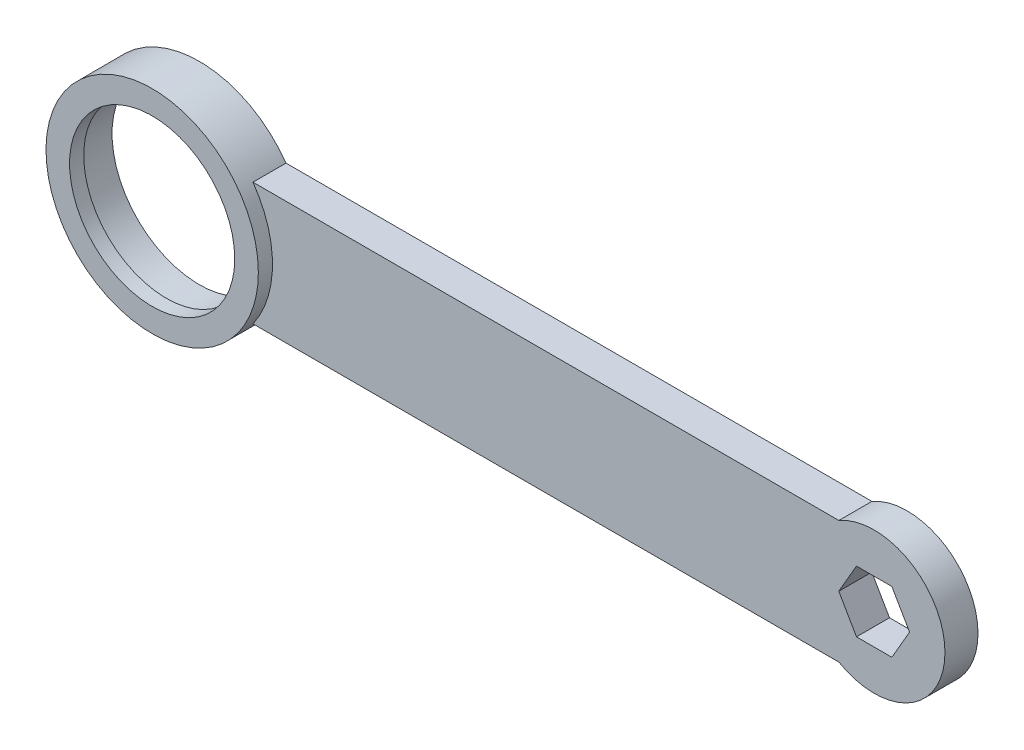
ISO-10303-21;
HEADER;
FILE_DESCRIPTION(('STEP AP214'),'2;1');
FILE_NAME('part.step','',(''),(''),'','','');
FILE_SCHEMA(('AUTOMOTIVE_DESIGN { 1 0 10303 214 1 1 1 1 }'));
ENDSEC;
DATA;
#1=APPLICATION_CONTEXT('core data for automotive mechanical design processes');
#2=APPLICATION_PROTOCOL_DEFINITION('international standard','automotive_design',2000,#1);
#3=PRODUCT_CONTEXT('',#1,'mechanical');
#4=PRODUCT('Part','Part','',(#3));
#5=PRODUCT_RELATED_PRODUCT_CATEGORY('part','',(#4));
#6=PRODUCT_DEFINITION_FORMATION('','',#4);
#7=PRODUCT_DEFINITION_CONTEXT('part definition',#1,'design');
#8=PRODUCT_DEFINITION('design','',#6,#7);
#9=PRODUCT_DEFINITION_SHAPE('','',#8);
#10=(LENGTH_UNIT() NAMED_UNIT(*) SI_UNIT(.MILLI.,.METRE.));
#11=(NAMED_UNIT(*) PLANE_ANGLE_UNIT() SI_UNIT($,.RADIAN.));
#12=(NAMED_UNIT(*) SI_UNIT($,.STERADIAN.) SOLID_ANGLE_UNIT());
#13=UNCERTAINTY_MEASURE_WITH_UNIT(LENGTH_MEASURE(1.E-05),#10,'distance_accuracy_value','');
#14=(GEOMETRIC_REPRESENTATION_CONTEXT(3) GLOBAL_UNCERTAINTY_ASSIGNED_CONTEXT((#13)) GLOBAL_UNIT_ASSIGNED_CONTEXT((#10,
#11,#12)) REPRESENTATION_CONTEXT('',''));
#15=CARTESIAN_POINT('',(0.,0.,0.));
#16=DIRECTION('',(0.,0.,1.));
#17=DIRECTION('',(1.,0.,0.));
#18=AXIS2_PLACEMENT_3D('',#15,#16,#17);
#19=CARTESIAN_POINT('',(-75.,0.,0.));
#20=DIRECTION('',(0.,0.,1.));
#21=DIRECTION('',(1.,0.,0.));
#22=AXIS2_PLACEMENT_3D('',#19,#20,#21);
#23=PLANE('',#22);
#24=CARTESIAN_POINT('',(-75.,0.,0.));
#25=DIRECTION('',(0.,0.,1.));
#26=DIRECTION('',(1.,0.,0.));
#27=AXIS2_PLACEMENT_3D('',#24,#25,#26);
#28=CIRCLE('',#27,22.5);
#29=CARTESIAN_POINT('',(-56.635632327793,13.,0.));
#30=VERTEX_POINT('',#29);
#31=CARTESIAN_POINT('',(-56.635632327793,-13.,0.));
#32=VERTEX_POINT('',#31);
#33=EDGE_CURVE('E152',#30,#32,#28,.T.);
#34=ORIENTED_EDGE('',*,*,#33,.F.);
#35=DIRECTION('',(-1.,0.,0.));
#36=VECTOR('',#35,1.);
#37=CARTESIAN_POINT('',(-56.635632327793,13.,0.));
#38=LINE('',#37,#36);
#39=CARTESIAN_POINT('',(67.5166852264522,13.,0.));
#40=VERTEX_POINT('',#39);
#41=EDGE_CURVE('E163',#40,#30,#38,.T.);
#42=ORIENTED_EDGE('',*,*,#41,.F.);
#43=CARTESIAN_POINT('',(75.,0.,0.));
#44=DIRECTION('',(0.,0.,1.));
#45=DIRECTION('',(1.,0.,0.));
#46=AXIS2_PLACEMENT_3D('',#43,#44,#45);
#47=CIRCLE('',#46,15.);
#48=CARTESIAN_POINT('',(67.5166852264522,-13.,0.));
#49=VERTEX_POINT('',#48);
#50=EDGE_CURVE('E161',#49,#40,#47,.T.);
#51=ORIENTED_EDGE('',*,*,#50,.F.);
#52=DIRECTION('',(1.,0.,0.));
#53=VECTOR('',#52,1.);
#54=CARTESIAN_POINT('',(-56.635632327793,-13.,0.));
#55=LINE('',#54,#53);
#56=EDGE_CURVE('E159',#32,#49,#55,.T.);
#57=ORIENTED_EDGE('',*,*,#56,.F.);
#58=EDGE_LOOP('',(#34,#42,#51,#57));
#59=FACE_BOUND('',#58,.T.);
#60=DIRECTION('',(1.,0.,0.));
#61=VECTOR('',#60,1.);
#62=CARTESIAN_POINT('',(-75.,-6.49519052838266,0.));
#63=LINE('',#62,#61);
#64=CARTESIAN_POINT('',(71.2499999999999,-6.49519052838325,0.));
#65=VERTEX_POINT('',#64);
#66=CARTESIAN_POINT('',(78.7499999999999,-6.49519052838328,0.));
#67=VERTEX_POINT('',#66);
#68=EDGE_CURVE('E41',#65,#67,#63,.T.);
#69=ORIENTED_EDGE('',*,*,#68,.T.);
#70=DIRECTION('',(0.500000000000002,0.866025403784438,0.));
#71=VECTOR('',#70,1.);
#72=CARTESIAN_POINT('',(43.1249999999997,-68.1995005480247,0.));
#73=LINE('',#72,#71);
#74=CARTESIAN_POINT('',(82.5,0.,0.));
#75=VERTEX_POINT('',#74);
#76=EDGE_CURVE('E11',#67,#75,#73,.T.);
#77=ORIENTED_EDGE('',*,*,#76,.T.);
#78=DIRECTION('',(-0.499999999999998,0.86602540378444,0.));
#79=VECTOR('',#78,1.);
#80=CARTESIAN_POINT('',(43.1250000000003,68.1995005480243,0.));
#81=LINE('',#80,#79);
#82=CARTESIAN_POINT('',(78.75,6.4951905283833,0.));
#83=VERTEX_POINT('',#82);
#84=EDGE_CURVE('E181',#75,#83,#81,.T.);
#85=ORIENTED_EDGE('',*,*,#84,.T.);
#86=DIRECTION('',(-1.,0.,0.));
#87=VECTOR('',#86,1.);
#88=CARTESIAN_POINT('',(-74.9999999999999,6.49519052838389,0.));
#89=LINE('',#88,#87);
#90=CARTESIAN_POINT('',(71.25,6.49519052838332,0.));
#91=VERTEX_POINT('',#90);
#92=EDGE_CURVE('E116',#83,#91,#89,.T.);
#93=ORIENTED_EDGE('',*,*,#92,.T.);
#94=DIRECTION('',(-0.500000000000003,-0.866025403784437,0.));
#95=VECTOR('',#94,1.);
#96=CARTESIAN_POINT('',(31.8749999999996,-61.7043100196414,0.));
#97=LINE('',#96,#95);
#98=CARTESIAN_POINT('',(67.5,0.,0.));
#99=VERTEX_POINT('',#98);
#100=EDGE_CURVE('E193',#91,#99,#97,.T.);
#101=ORIENTED_EDGE('',*,*,#100,.T.);
#102=DIRECTION('',(0.499999999999996,-0.866025403784441,0.));
#103=VECTOR('',#102,1.);
#104=CARTESIAN_POINT('',(31.8750000000006,61.7043100196409,0.));
#105=LINE('',#104,#103);
#106=EDGE_CURVE('E196',#99,#65,#105,.T.);
#107=ORIENTED_EDGE('',*,*,#106,.T.);
#108=EDGE_LOOP('',(#69,#77,#85,#93,#101,#107));
#109=FACE_BOUND('',#108,.T.);
#110=CARTESIAN_POINT('',(-75.,0.,0.));
#111=DIRECTION('',(0.,0.,1.));
#112=DIRECTION('',(1.,0.,0.));
#113=AXIS2_PLACEMENT_3D('',#110,#111,#112);
#114=CIRCLE('',#113,18.5);
#115=CARTESIAN_POINT('',(-56.5,0.,0.));
#116=VERTEX_POINT('',#115);
#117=EDGE_CURVE('E214',#116,#116,#114,.T.);
#118=ORIENTED_EDGE('',*,*,#117,.T.);
#119=EDGE_LOOP('',(#118));
#120=FACE_BOUND('',#119,.T.);
#121=ADVANCED_FACE('F32',(#59,#109,#120),#23,.F.);
#122=CARTESIAN_POINT('',(-75.,0.,7.));
#123=DIRECTION('',(0.,0.,-1.));
#124=DIRECTION('',(-1.,0.,0.));
#125=AXIS2_PLACEMENT_3D('',#122,#123,#124);
#126=CYLINDRICAL_SURFACE('',#125,22.5);
#127=ORIENTED_EDGE('',*,*,#33,.T.);
#128=DIRECTION('',(0.,0.,-1.));
#129=VECTOR('',#128,1.);
#130=CARTESIAN_POINT('',(-56.635632327793,-13.,7.));
#131=LINE('',#130,#129);
#132=CARTESIAN_POINT('',(-56.635632327793,-13.,7.));
#133=VERTEX_POINT('',#132);
#134=EDGE_CURVE('E172',#133,#32,#131,.T.);
#135=ORIENTED_EDGE('',*,*,#134,.F.);
#136=CARTESIAN_POINT('',(-75.,0.,7.));
#137=DIRECTION('',(0.,0.,1.));
#138=DIRECTION('',(1.,0.,0.));
#139=AXIS2_PLACEMENT_3D('',#136,#137,#138);
#140=CIRCLE('',#139,22.5);
#141=CARTESIAN_POINT('',(-56.635632327793,13.,7.));
#142=VERTEX_POINT('',#141);
#143=EDGE_CURVE('E177',#133,#142,#140,.T.);
#144=ORIENTED_EDGE('',*,*,#143,.T.);
#145=DIRECTION('',(0.,0.,-1.));
#146=VECTOR('',#145,1.);
#147=CARTESIAN_POINT('',(-56.635632327793,13.,7.));
#148=LINE('',#147,#146);
#149=EDGE_CURVE('E169',#142,#30,#148,.T.);
#150=ORIENTED_EDGE('',*,*,#149,.T.);
#151=EDGE_LOOP('',(#127,#135,#144,#150));
#152=FACE_BOUND('',#151,.T.);
#153=CARTESIAN_POINT('',(-75.,0.,10.));
#154=DIRECTION('',(0.,0.,1.));
#155=DIRECTION('',(1.,0.,0.));
#156=AXIS2_PLACEMENT_3D('',#153,#154,#155);
#157=CIRCLE('',#156,22.5);
#158=CARTESIAN_POINT('',(-52.5,0.,10.));
#159=VERTEX_POINT('',#158);
#160=EDGE_CURVE('E143',#159,#159,#157,.T.);
#161=ORIENTED_EDGE('',*,*,#160,.F.);
#162=EDGE_LOOP('',(#161));
#163=FACE_BOUND('',#162,.T.);
#164=ADVANCED_FACE('F34',(#152,#163),#126,.T.);
#165=CARTESIAN_POINT('',(-56.635632327793,-13.,7.));
#166=DIRECTION('',(0.,1.,0.));
#167=DIRECTION('',(-1.,0.,0.));
#168=AXIS2_PLACEMENT_3D('',#165,#166,#167);
#169=PLANE('',#168);
#170=ORIENTED_EDGE('',*,*,#56,.T.);
#171=DIRECTION('',(0.,0.,-1.));
#172=VECTOR('',#171,1.);
#173=CARTESIAN_POINT('',(67.5166852264522,-13.,7.));
#174=LINE('',#173,#172);
#175=CARTESIAN_POINT('',(67.5166852264522,-13.,7.));
#176=VERTEX_POINT('',#175);
#177=EDGE_CURVE('E168',#176,#49,#174,.T.);
#178=ORIENTED_EDGE('',*,*,#177,.F.);
#179=DIRECTION('',(1.,0.,0.));
#180=VECTOR('',#179,1.);
#181=CARTESIAN_POINT('',(-56.635632327793,-13.,7.));
#182=LINE('',#181,#180);
#183=EDGE_CURVE('E156',#133,#176,#182,.T.);
#184=ORIENTED_EDGE('',*,*,#183,.F.);
#185=ORIENTED_EDGE('',*,*,#134,.T.);
#186=EDGE_LOOP('',(#170,#178,#184,#185));
#187=FACE_BOUND('',#186,.T.);
#188=ADVANCED_FACE('F244',(#187),#169,.F.);
#189=CARTESIAN_POINT('',(75.,0.,7.));
#190=DIRECTION('',(0.,0.,-1.));
#191=DIRECTION('',(-1.,0.,0.));
#192=AXIS2_PLACEMENT_3D('',#189,#190,#191);
#193=CYLINDRICAL_SURFACE('',#192,15.);
#194=ORIENTED_EDGE('',*,*,#50,.T.);
#195=DIRECTION('',(0.,0.,-1.));
#196=VECTOR('',#195,1.);
#197=CARTESIAN_POINT('',(67.5166852264522,13.,7.));
#198=LINE('',#197,#196);
#199=CARTESIAN_POINT('',(67.5166852264522,13.,7.));
#200=VERTEX_POINT('',#199);
#201=EDGE_CURVE('E165',#200,#40,#198,.T.);
#202=ORIENTED_EDGE('',*,*,#201,.F.);
#203=CARTESIAN_POINT('',(75.,0.,7.));
#204=DIRECTION('',(0.,0.,1.));
#205=DIRECTION('',(1.,0.,0.));
#206=AXIS2_PLACEMENT_3D('',#203,#204,#205);
#207=CIRCLE('',#206,15.);
#208=EDGE_CURVE('E153',#176,#200,#207,.T.);
#209=ORIENTED_EDGE('',*,*,#208,.F.);
#210=ORIENTED_EDGE('',*,*,#177,.T.);
#211=EDGE_LOOP('',(#194,#202,#209,#210));
#212=FACE_BOUND('',#211,.T.);
#213=ADVANCED_FACE('F253',(#212),#193,.T.);
#214=CARTESIAN_POINT('',(-56.635632327793,13.,7.));
#215=DIRECTION('',(0.,-1.,0.));
#216=DIRECTION('',(1.,0.,0.));
#217=AXIS2_PLACEMENT_3D('',#214,#215,#216);
#218=PLANE('',#217);
#219=ORIENTED_EDGE('',*,*,#41,.T.);
#220=ORIENTED_EDGE('',*,*,#149,.F.);
#221=DIRECTION('',(-1.,0.,0.));
#222=VECTOR('',#221,1.);
#223=CARTESIAN_POINT('',(-56.635632327793,13.,7.));
#224=LINE('',#223,#222);
#225=EDGE_CURVE('E155',#200,#142,#224,.T.);
#226=ORIENTED_EDGE('',*,*,#225,.F.);
#227=ORIENTED_EDGE('',*,*,#201,.T.);
#228=EDGE_LOOP('',(#219,#220,#226,#227));
#229=FACE_BOUND('',#228,.T.);
#230=ADVANCED_FACE('F250',(#229),#218,.F.);
#231=CARTESIAN_POINT('',(-75.,0.,7.));
#232=DIRECTION('',(0.,0.,1.));
#233=DIRECTION('',(1.,0.,0.));
#234=AXIS2_PLACEMENT_3D('',#231,#232,#233);
#235=PLANE('',#234);
#236=DIRECTION('',(0.500000000000002,0.866025403784437,0.));
#237=VECTOR('',#236,1.);
#238=CARTESIAN_POINT('',(78.7499999999999,-6.49519052838328,7.));
#239=LINE('',#238,#237);
#240=CARTESIAN_POINT('',(78.7499999999999,-6.49519052838328,7.));
#241=VERTEX_POINT('',#240);
#242=CARTESIAN_POINT('',(82.5,0.,7.));
#243=VERTEX_POINT('',#242);
#244=EDGE_CURVE('E48',#241,#243,#239,.T.);
#245=ORIENTED_EDGE('',*,*,#244,.F.);
#246=DIRECTION('',(1.,0.,0.));
#247=VECTOR('',#246,1.);
#248=CARTESIAN_POINT('',(71.2499999999999,-6.49519052838325,7.));
#249=LINE('',#248,#247);
#250=CARTESIAN_POINT('',(71.2499999999999,-6.49519052838325,7.));
#251=VERTEX_POINT('',#250);
#252=EDGE_CURVE('E138',#251,#241,#249,.T.);
#253=ORIENTED_EDGE('',*,*,#252,.F.);
#254=DIRECTION('',(0.499999999999996,-0.866025403784441,0.));
#255=VECTOR('',#254,1.);
#256=CARTESIAN_POINT('',(67.5,0.,7.));
#257=LINE('',#256,#255);
#258=CARTESIAN_POINT('',(67.5,0.,7.));
#259=VERTEX_POINT('',#258);
#260=EDGE_CURVE('E132',#259,#251,#257,.T.);
#261=ORIENTED_EDGE('',*,*,#260,.F.);
#262=DIRECTION('',(-0.500000000000003,-0.866025403784437,0.));
#263=VECTOR('',#262,1.);
#264=CARTESIAN_POINT('',(71.25,6.49519052838332,7.));
#265=LINE('',#264,#263);
#266=CARTESIAN_POINT('',(71.25,6.49519052838332,7.));
#267=VERTEX_POINT('',#266);
#268=EDGE_CURVE('E130',#267,#259,#265,.T.);
#269=ORIENTED_EDGE('',*,*,#268,.F.);
#270=DIRECTION('',(-1.,0.,0.));
#271=VECTOR('',#270,1.);
#272=CARTESIAN_POINT('',(78.75,6.49519052838329,7.));
#273=LINE('',#272,#271);
#274=CARTESIAN_POINT('',(78.75,6.49519052838329,7.));
#275=VERTEX_POINT('',#274);
#276=EDGE_CURVE('E113',#275,#267,#273,.T.);
#277=ORIENTED_EDGE('',*,*,#276,.F.);
#278=DIRECTION('',(-0.499999999999998,0.86602540378444,0.));
#279=VECTOR('',#278,1.);
#280=CARTESIAN_POINT('',(82.5,0.,7.));
#281=LINE('',#280,#279);
#282=EDGE_CURVE('E122',#243,#275,#281,.T.);
#283=ORIENTED_EDGE('',*,*,#282,.F.);
#284=EDGE_LOOP('',(#245,#253,#261,#269,#277,#283));
#285=FACE_BOUND('',#284,.T.);
#286=ORIENTED_EDGE('',*,*,#143,.F.);
#287=ORIENTED_EDGE('',*,*,#183,.T.);
#288=ORIENTED_EDGE('',*,*,#208,.T.);
#289=ORIENTED_EDGE('',*,*,#225,.T.);
#290=EDGE_LOOP('',(#286,#287,#288,#289));
#291=FACE_BOUND('',#290,.T.);
#292=ADVANCED_FACE('F126',(#285,#291),#235,.T.);
#293=CARTESIAN_POINT('',(-75.,0.,10.));
#294=DIRECTION('',(0.,0.,1.));
#295=DIRECTION('',(1.,0.,0.));
#296=AXIS2_PLACEMENT_3D('',#293,#294,#295);
#297=PLANE('',#296);
#298=CARTESIAN_POINT('',(-75.,0.,10.));
#299=DIRECTION('',(0.,0.,1.));
#300=DIRECTION('',(1.,0.,0.));
#301=AXIS2_PLACEMENT_3D('',#298,#299,#300);
#302=CIRCLE('',#301,17.5);
#303=CARTESIAN_POINT('',(-57.5,0.,10.));
#304=VERTEX_POINT('',#303);
#305=EDGE_CURVE('E210',#304,#304,#302,.T.);
#306=ORIENTED_EDGE('',*,*,#305,.F.);
#307=EDGE_LOOP('',(#306));
#308=FACE_BOUND('',#307,.T.);
#309=ORIENTED_EDGE('',*,*,#160,.T.);
#310=EDGE_LOOP('',(#309));
#311=FACE_BOUND('',#310,.T.);
#312=ADVANCED_FACE('F274',(#308,#311),#297,.T.);
#313=CARTESIAN_POINT('',(78.7499999999999,-6.49519052838328,-2.49999999998515E-05));
#314=DIRECTION('',(0.866025403784438,-0.500000000000002,0.));
#315=DIRECTION('',(0.500000000000002,0.866025403784438,0.));
#316=AXIS2_PLACEMENT_3D('',#313,#314,#315);
#317=PLANE('',#316);
#318=DIRECTION('',(0.,0.,1.));
#319=VECTOR('',#318,1.);
#320=CARTESIAN_POINT('',(78.7499999999999,-6.49519052838328,-2.49999999998515E-05));
#321=LINE('',#320,#319);
#322=EDGE_CURVE('E141',#67,#241,#321,.T.);
#323=ORIENTED_EDGE('',*,*,#322,.T.);
#324=ORIENTED_EDGE('',*,*,#244,.T.);
#325=DIRECTION('',(0.,0.,1.));
#326=VECTOR('',#325,1.);
#327=CARTESIAN_POINT('',(82.5,0.,-2.49999999998515E-05));
#328=LINE('',#327,#326);
#329=EDGE_CURVE('E119',#75,#243,#328,.T.);
#330=ORIENTED_EDGE('',*,*,#329,.F.);
#331=ORIENTED_EDGE('',*,*,#76,.F.);
#332=EDGE_LOOP('',(#323,#324,#330,#331));
#333=FACE_BOUND('',#332,.T.);
#334=ADVANCED_FACE('F278',(#333),#317,.F.);
#335=CARTESIAN_POINT('',(71.2499999999999,-6.49519052838325,-2.49999999998515E-05));
#336=DIRECTION('',(0.,-1.,0.));
#337=DIRECTION('',(1.,0.,0.));
#338=AXIS2_PLACEMENT_3D('',#335,#336,#337);
#339=PLANE('',#338);
#340=DIRECTION('',(0.,0.,1.));
#341=VECTOR('',#340,1.);
#342=CARTESIAN_POINT('',(71.2499999999999,-6.49519052838325,-2.49999999998515E-05));
#343=LINE('',#342,#341);
#344=EDGE_CURVE('E144',#65,#251,#343,.T.);
#345=ORIENTED_EDGE('',*,*,#344,.T.);
#346=ORIENTED_EDGE('',*,*,#252,.T.);
#347=ORIENTED_EDGE('',*,*,#322,.F.);
#348=ORIENTED_EDGE('',*,*,#68,.F.);
#349=EDGE_LOOP('',(#345,#346,#347,#348));
#350=FACE_BOUND('',#349,.T.);
#351=ADVANCED_FACE('F205',(#350),#339,.F.);
#352=CARTESIAN_POINT('',(67.5,0.,-2.49999999998515E-05));
#353=DIRECTION('',(-0.866025403784441,-0.499999999999996,0.));
#354=DIRECTION('',(0.499999999999996,-0.866025403784441,0.));
#355=AXIS2_PLACEMENT_3D('',#352,#353,#354);
#356=PLANE('',#355);
#357=DIRECTION('',(0.,0.,1.));
#358=VECTOR('',#357,1.);
#359=CARTESIAN_POINT('',(67.5,0.,-2.49999999998515E-05));
#360=LINE('',#359,#358);
#361=EDGE_CURVE('E146',#99,#259,#360,.T.);
#362=ORIENTED_EDGE('',*,*,#361,.T.);
#363=ORIENTED_EDGE('',*,*,#260,.T.);
#364=ORIENTED_EDGE('',*,*,#344,.F.);
#365=ORIENTED_EDGE('',*,*,#106,.F.);
#366=EDGE_LOOP('',(#362,#363,#364,#365));
#367=FACE_BOUND('',#366,.T.);
#368=ADVANCED_FACE('F207',(#367),#356,.F.);
#369=CARTESIAN_POINT('',(71.25,6.49519052838332,-2.49999999998515E-05));
#370=DIRECTION('',(-0.866025403784437,0.500000000000003,0.));
#371=DIRECTION('',(-0.500000000000003,-0.866025403784437,0.));
#372=AXIS2_PLACEMENT_3D('',#369,#370,#371);
#373=PLANE('',#372);
#374=DIRECTION('',(0.,0.,1.));
#375=VECTOR('',#374,1.);
#376=CARTESIAN_POINT('',(71.25,6.49519052838332,-2.49999999998515E-05));
#377=LINE('',#376,#375);
#378=EDGE_CURVE('E118',#91,#267,#377,.T.);
#379=ORIENTED_EDGE('',*,*,#378,.T.);
#380=ORIENTED_EDGE('',*,*,#268,.T.);
#381=ORIENTED_EDGE('',*,*,#361,.F.);
#382=ORIENTED_EDGE('',*,*,#100,.F.);
#383=EDGE_LOOP('',(#379,#380,#381,#382));
#384=FACE_BOUND('',#383,.T.);
#385=ADVANCED_FACE('F291',(#384),#373,.F.);
#386=CARTESIAN_POINT('',(78.75,6.49519052838329,-2.49999999998515E-05));
#387=DIRECTION('',(0.,1.,0.));
#388=DIRECTION('',(-1.,0.,0.));
#389=AXIS2_PLACEMENT_3D('',#386,#387,#388);
#390=PLANE('',#389);
#391=DIRECTION('',(0.,0.,1.));
#392=VECTOR('',#391,1.);
#393=CARTESIAN_POINT('',(78.75,6.49519052838329,-2.49999999998515E-05));
#394=LINE('',#393,#392);
#395=EDGE_CURVE('E56',#83,#275,#394,.T.);
#396=ORIENTED_EDGE('',*,*,#395,.T.);
#397=ORIENTED_EDGE('',*,*,#276,.T.);
#398=ORIENTED_EDGE('',*,*,#378,.F.);
#399=ORIENTED_EDGE('',*,*,#92,.F.);
#400=EDGE_LOOP('',(#396,#397,#398,#399));
#401=FACE_BOUND('',#400,.T.);
#402=ADVANCED_FACE('F110',(#401),#390,.F.);
#403=CARTESIAN_POINT('',(82.5,0.,-2.49999999998515E-05));
#404=DIRECTION('',(0.86602540378444,0.499999999999998,0.));
#405=DIRECTION('',(-0.499999999999998,0.86602540378444,0.));
#406=AXIS2_PLACEMENT_3D('',#403,#404,#405);
#407=PLANE('',#406);
#408=ORIENTED_EDGE('',*,*,#329,.T.);
#409=ORIENTED_EDGE('',*,*,#282,.T.);
#410=ORIENTED_EDGE('',*,*,#395,.F.);
#411=ORIENTED_EDGE('',*,*,#84,.F.);
#412=EDGE_LOOP('',(#408,#409,#410,#411));
#413=FACE_BOUND('',#412,.T.);
#414=ADVANCED_FACE('F123',(#413),#407,.F.);
#415=CARTESIAN_POINT('',(-75.,0.,-2.50000000007189E-05));
#416=DIRECTION('',(0.,0.,1.));
#417=DIRECTION('',(1.,0.,0.));
#418=AXIS2_PLACEMENT_3D('',#415,#416,#417);
#419=CYLINDRICAL_SURFACE('',#418,17.5);
#420=CARTESIAN_POINT('',(-75.,0.,7.));
#421=DIRECTION('',(0.,0.,1.));
#422=DIRECTION('',(1.,0.,0.));
#423=AXIS2_PLACEMENT_3D('',#420,#421,#422);
#424=CIRCLE('',#423,17.5);
#425=CARTESIAN_POINT('',(-57.5,0.,7.));
#426=VERTEX_POINT('',#425);
#427=EDGE_CURVE('E36',#426,#426,#424,.F.);
#428=ORIENTED_EDGE('',*,*,#427,.T.);
#429=EDGE_LOOP('',(#428));
#430=FACE_BOUND('',#429,.T.);
#431=ORIENTED_EDGE('',*,*,#305,.T.);
#432=EDGE_LOOP('',(#431));
#433=FACE_BOUND('',#432,.T.);
#434=ADVANCED_FACE('F224',(#430,#433),#419,.F.);
#435=CARTESIAN_POINT('',(-75.,0.,7.));
#436=DIRECTION('',(0.,0.,1.));
#437=DIRECTION('',(1.,0.,0.));
#438=AXIS2_PLACEMENT_3D('',#435,#436,#437);
#439=PLANE('',#438);
#440=CARTESIAN_POINT('',(-75.,0.,7.));
#441=DIRECTION('',(0.,0.,1.));
#442=DIRECTION('',(1.,0.,0.));
#443=AXIS2_PLACEMENT_3D('',#440,#441,#442);
#444=CIRCLE('',#443,18.5);
#445=CARTESIAN_POINT('',(-56.5,0.,7.));
#446=VERTEX_POINT('',#445);
#447=EDGE_CURVE('E217',#446,#446,#444,.T.);
#448=ORIENTED_EDGE('',*,*,#447,.F.);
#449=EDGE_LOOP('',(#448));
#450=FACE_BOUND('',#449,.T.);
#451=ORIENTED_EDGE('',*,*,#427,.F.);
#452=EDGE_LOOP('',(#451));
#453=FACE_BOUND('',#452,.T.);
#454=ADVANCED_FACE('F227',(#450,#453),#439,.F.);
#455=CARTESIAN_POINT('',(-75.,0.,7.));
#456=DIRECTION('',(0.,0.,-1.));
#457=DIRECTION('',(-1.,0.,0.));
#458=AXIS2_PLACEMENT_3D('',#455,#456,#457);
#459=CYLINDRICAL_SURFACE('',#458,18.5);
#460=ORIENTED_EDGE('',*,*,#447,.T.);
#461=EDGE_LOOP('',(#460));
#462=FACE_BOUND('',#461,.T.);
#463=ORIENTED_EDGE('',*,*,#117,.F.);
#464=EDGE_LOOP('',(#463));
#465=FACE_BOUND('',#464,.T.);
#466=ADVANCED_FACE('F229',(#462,#465),#459,.F.);
#467=CLOSED_SHELL('',(#121,#164,#188,#213,#230,#292,#312,#334,#351,#368,#385,#402,#414,#434,
#454,#466));
#468=MANIFOLD_SOLID_BREP('B2',#467);
#469=ADVANCED_BREP_SHAPE_REPRESENTATION('',(#18,#468),#14);
#470=SHAPE_DEFINITION_REPRESENTATION(#9,#469);
ENDSEC;
END-ISO-10303-21;
